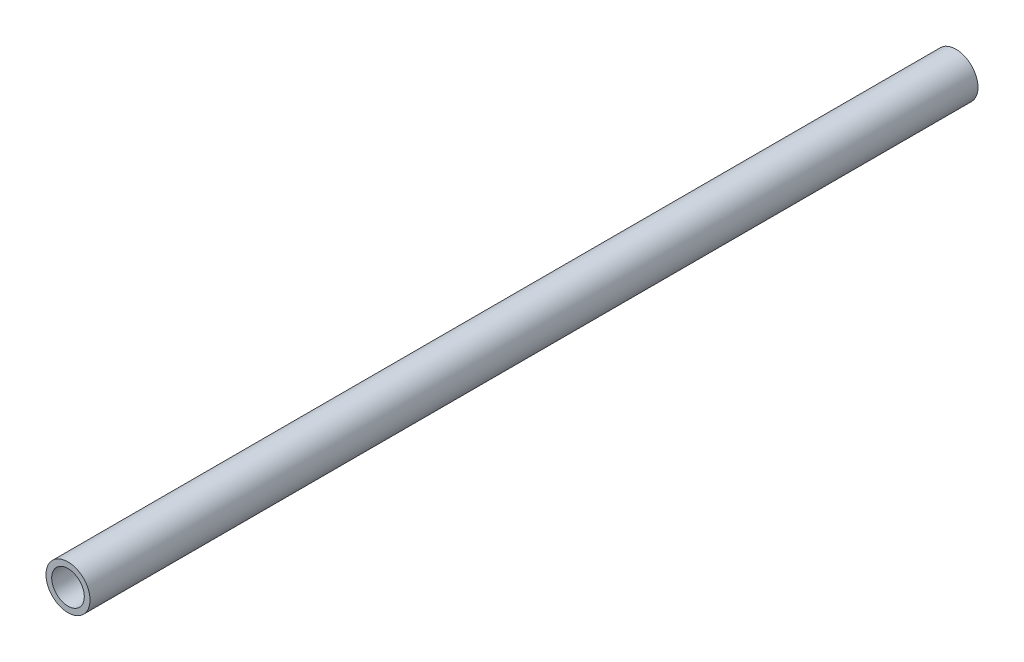
ISO-10303-21;
HEADER;
FILE_DESCRIPTION(('STEP AP214'),'2;1');
FILE_NAME('part.step','',(''),(''),'','','');
FILE_SCHEMA(('AUTOMOTIVE_DESIGN { 1 0 10303 214 1 1 1 1 }'));
ENDSEC;
DATA;
#1=APPLICATION_CONTEXT('core data for automotive mechanical design processes');
#2=APPLICATION_PROTOCOL_DEFINITION('international standard','automotive_design',2000,#1);
#3=PRODUCT_CONTEXT('',#1,'mechanical');
#4=PRODUCT('Part','Part','',(#3));
#5=PRODUCT_RELATED_PRODUCT_CATEGORY('part','',(#4));
#6=PRODUCT_DEFINITION_FORMATION('','',#4);
#7=PRODUCT_DEFINITION_CONTEXT('part definition',#1,'design');
#8=PRODUCT_DEFINITION('design','',#6,#7);
#9=PRODUCT_DEFINITION_SHAPE('','',#8);
#10=(LENGTH_UNIT() NAMED_UNIT(*) SI_UNIT(.MILLI.,.METRE.));
#11=(NAMED_UNIT(*) PLANE_ANGLE_UNIT() SI_UNIT($,.RADIAN.));
#12=(NAMED_UNIT(*) SI_UNIT($,.STERADIAN.) SOLID_ANGLE_UNIT());
#13=UNCERTAINTY_MEASURE_WITH_UNIT(LENGTH_MEASURE(1.E-05),#10,'distance_accuracy_value','');
#14=(GEOMETRIC_REPRESENTATION_CONTEXT(3) GLOBAL_UNCERTAINTY_ASSIGNED_CONTEXT((#13)) GLOBAL_UNIT_ASSIGNED_CONTEXT((#10,
#11,#12)) REPRESENTATION_CONTEXT('',''));
#15=CARTESIAN_POINT('',(0.,0.,0.));
#16=DIRECTION('',(0.,0.,1.));
#17=DIRECTION('',(1.,0.,0.));
#18=AXIS2_PLACEMENT_3D('',#15,#16,#17);
#19=CARTESIAN_POINT('',(0.,0.,215.));
#20=DIRECTION('',(0.,0.,1.));
#21=DIRECTION('',(1.,0.,0.));
#22=AXIS2_PLACEMENT_3D('',#19,#20,#21);
#23=PLANE('',#22);
#24=CARTESIAN_POINT('',(0.,0.,215.));
#25=DIRECTION('',(0.,0.,1.));
#26=DIRECTION('',(1.,0.,0.));
#27=AXIS2_PLACEMENT_3D('',#24,#25,#26);
#28=CIRCLE('',#27,10.668);
#29=CARTESIAN_POINT('',(10.668,0.,215.));
#30=VERTEX_POINT('',#29);
#31=EDGE_CURVE('E11',#30,#30,#28,.T.);
#32=ORIENTED_EDGE('',*,*,#31,.T.);
#33=EDGE_LOOP('',(#32));
#34=FACE_BOUND('',#33,.T.);
#35=CARTESIAN_POINT('',(0.,0.,215.));
#36=DIRECTION('',(0.,0.,1.));
#37=DIRECTION('',(1.,0.,0.));
#38=AXIS2_PLACEMENT_3D('',#35,#36,#37);
#39=CIRCLE('',#38,7.8994);
#40=CARTESIAN_POINT('',(7.8994,0.,215.));
#41=VERTEX_POINT('',#40);
#42=EDGE_CURVE('E48',#41,#41,#39,.T.);
#43=ORIENTED_EDGE('',*,*,#42,.F.);
#44=EDGE_LOOP('',(#43));
#45=FACE_BOUND('',#44,.T.);
#46=ADVANCED_FACE('F37',(#34,#45),#23,.T.);
#47=CARTESIAN_POINT('',(0.,0.,-215.));
#48=DIRECTION('',(0.,0.,1.));
#49=DIRECTION('',(1.,0.,0.));
#50=AXIS2_PLACEMENT_3D('',#47,#48,#49);
#51=PLANE('',#50);
#52=CARTESIAN_POINT('',(0.,0.,-215.));
#53=DIRECTION('',(0.,0.,1.));
#54=DIRECTION('',(1.,0.,0.));
#55=AXIS2_PLACEMENT_3D('',#52,#53,#54);
#56=CIRCLE('',#55,10.668);
#57=CARTESIAN_POINT('',(10.668,0.,-215.));
#58=VERTEX_POINT('',#57);
#59=EDGE_CURVE('E41',#58,#58,#56,.T.);
#60=ORIENTED_EDGE('',*,*,#59,.F.);
#61=EDGE_LOOP('',(#60));
#62=FACE_BOUND('',#61,.T.);
#63=CARTESIAN_POINT('',(0.,0.,-215.));
#64=DIRECTION('',(0.,0.,1.));
#65=DIRECTION('',(1.,0.,0.));
#66=AXIS2_PLACEMENT_3D('',#63,#64,#65);
#67=CIRCLE('',#66,7.8994);
#68=CARTESIAN_POINT('',(7.8994,0.,-215.));
#69=VERTEX_POINT('',#68);
#70=EDGE_CURVE('E50',#69,#69,#67,.T.);
#71=ORIENTED_EDGE('',*,*,#70,.T.);
#72=EDGE_LOOP('',(#71));
#73=FACE_BOUND('',#72,.T.);
#74=ADVANCED_FACE('F60',(#62,#73),#51,.F.);
#75=CARTESIAN_POINT('',(0.,0.,215.));
#76=DIRECTION('',(0.,0.,-1.));
#77=DIRECTION('',(-1.,0.,0.));
#78=AXIS2_PLACEMENT_3D('',#75,#76,#77);
#79=CYLINDRICAL_SURFACE('',#78,10.668);
#80=ORIENTED_EDGE('',*,*,#31,.F.);
#81=EDGE_LOOP('',(#80));
#82=FACE_BOUND('',#81,.T.);
#83=ORIENTED_EDGE('',*,*,#59,.T.);
#84=EDGE_LOOP('',(#83));
#85=FACE_BOUND('',#84,.T.);
#86=ADVANCED_FACE('F39',(#82,#85),#79,.T.);
#87=CARTESIAN_POINT('',(0.,0.,215.));
#88=DIRECTION('',(0.,0.,-1.));
#89=DIRECTION('',(-1.,0.,0.));
#90=AXIS2_PLACEMENT_3D('',#87,#88,#89);
#91=CYLINDRICAL_SURFACE('',#90,7.8994);
#92=ORIENTED_EDGE('',*,*,#42,.T.);
#93=EDGE_LOOP('',(#92));
#94=FACE_BOUND('',#93,.T.);
#95=ORIENTED_EDGE('',*,*,#70,.F.);
#96=EDGE_LOOP('',(#95));
#97=FACE_BOUND('',#96,.T.);
#98=ADVANCED_FACE('F56',(#94,#97),#91,.F.);
#99=CLOSED_SHELL('',(#46,#74,#86,#98));
#100=MANIFOLD_SOLID_BREP('B2',#99);
#101=ADVANCED_BREP_SHAPE_REPRESENTATION('',(#18,#100),#14);
#102=SHAPE_DEFINITION_REPRESENTATION(#9,#101);
ENDSEC;
END-ISO-10303-21;
